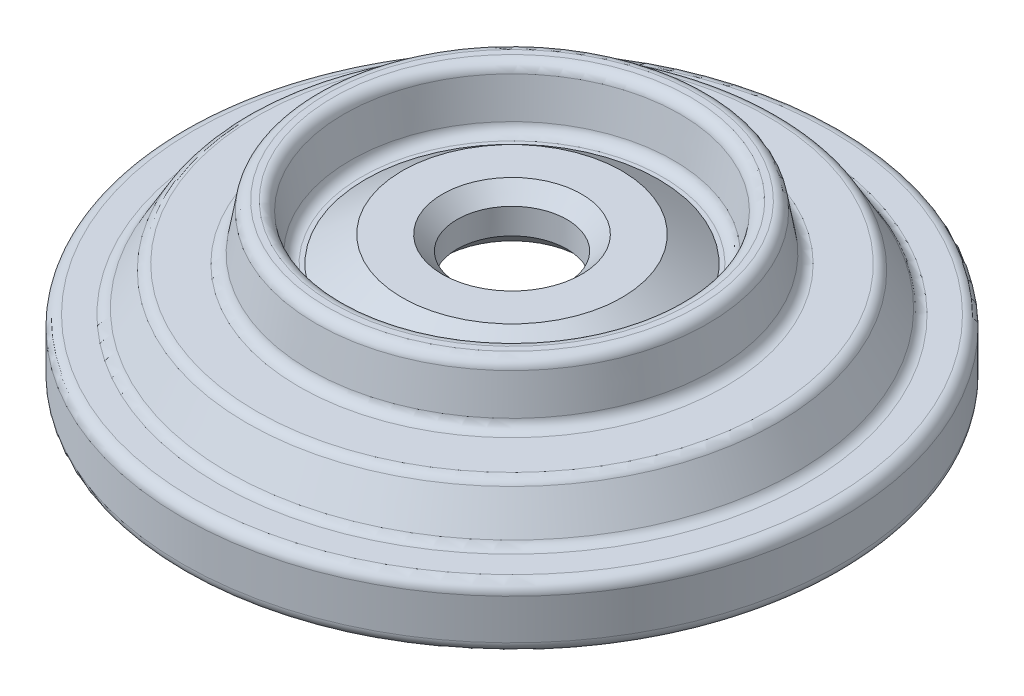
ISO-10303-21;
HEADER;
FILE_DESCRIPTION(('STEP AP214'),'2;1');
FILE_NAME('part.step','',(''),(''),'','','');
FILE_SCHEMA(('AUTOMOTIVE_DESIGN { 1 0 10303 214 1 1 1 1 }'));
ENDSEC;
DATA;
#1=APPLICATION_CONTEXT('core data for automotive mechanical design processes');
#2=APPLICATION_PROTOCOL_DEFINITION('international standard','automotive_design',2000,#1);
#3=PRODUCT_CONTEXT('',#1,'mechanical');
#4=PRODUCT('Part','Part','',(#3));
#5=PRODUCT_RELATED_PRODUCT_CATEGORY('part','',(#4));
#6=PRODUCT_DEFINITION_FORMATION('','',#4);
#7=PRODUCT_DEFINITION_CONTEXT('part definition',#1,'design');
#8=PRODUCT_DEFINITION('design','',#6,#7);
#9=PRODUCT_DEFINITION_SHAPE('','',#8);
#10=(LENGTH_UNIT() NAMED_UNIT(*) SI_UNIT(.MILLI.,.METRE.));
#11=(NAMED_UNIT(*) PLANE_ANGLE_UNIT() SI_UNIT($,.RADIAN.));
#12=(NAMED_UNIT(*) SI_UNIT($,.STERADIAN.) SOLID_ANGLE_UNIT());
#13=UNCERTAINTY_MEASURE_WITH_UNIT(LENGTH_MEASURE(1.E-05),#10,'distance_accuracy_value','');
#14=(GEOMETRIC_REPRESENTATION_CONTEXT(3) GLOBAL_UNCERTAINTY_ASSIGNED_CONTEXT((#13)) GLOBAL_UNIT_ASSIGNED_CONTEXT((#10,
#11,#12)) REPRESENTATION_CONTEXT('',''));
#15=CARTESIAN_POINT('',(0.,0.,0.));
#16=DIRECTION('',(0.,0.,1.));
#17=DIRECTION('',(1.,0.,0.));
#18=AXIS2_PLACEMENT_3D('',#15,#16,#17);
#19=CARTESIAN_POINT('',(-30.,15.,0.));
#20=DIRECTION('',(0.,1.,0.));
#21=DIRECTION('',(0.,0.,1.));
#22=AXIS2_PLACEMENT_3D('',#19,#20,#21);
#23=PLANE('',#22);
#24=CARTESIAN_POINT('',(0.,15.,0.));
#25=DIRECTION('',(0.,1.,0.));
#26=DIRECTION('',(0.,0.,1.));
#27=AXIS2_PLACEMENT_3D('',#24,#25,#26);
#28=CIRCLE('',#27,19.);
#29=CARTESIAN_POINT('',(0.,15.,19.));
#30=VERTEX_POINT('',#29);
#31=EDGE_CURVE('E10',#30,#30,#28,.F.);
#32=ORIENTED_EDGE('',*,*,#31,.T.);
#33=EDGE_LOOP('',(#32));
#34=FACE_BOUND('',#33,.T.);
#35=CARTESIAN_POINT('',(0.,15.,0.));
#36=DIRECTION('',(0.,1.,0.));
#37=DIRECTION('',(0.,0.,1.));
#38=AXIS2_PLACEMENT_3D('',#35,#36,#37);
#39=CIRCLE('',#38,30.);
#40=CARTESIAN_POINT('',(0.,15.,30.));
#41=VERTEX_POINT('',#40);
#42=EDGE_CURVE('E142',#41,#41,#39,.T.);
#43=ORIENTED_EDGE('',*,*,#42,.T.);
#44=EDGE_LOOP('',(#43));
#45=FACE_BOUND('',#44,.T.);
#46=ADVANCED_FACE('F41',(#34,#45),#23,.T.);
#47=CARTESIAN_POINT('',(0.,85.703125,0.));
#48=DIRECTION('',(0.,1.,0.));
#49=DIRECTION('',(0.,0.,1.));
#50=AXIS2_PLACEMENT_3D('',#47,#48,#49);
#51=CYLINDRICAL_SURFACE('',#50,15.);
#52=CARTESIAN_POINT('',(0.,4.00000000000002,0.));
#53=DIRECTION('',(0.,-1.,0.));
#54=DIRECTION('',(0.,0.,-1.));
#55=AXIS2_PLACEMENT_3D('',#52,#53,#54);
#56=CIRCLE('',#55,15.);
#57=CARTESIAN_POINT('',(0.,4.00000000000002,-15.));
#58=VERTEX_POINT('',#57);
#59=EDGE_CURVE('E50',#58,#58,#56,.T.);
#60=ORIENTED_EDGE('',*,*,#59,.T.);
#61=EDGE_LOOP('',(#60));
#62=FACE_BOUND('',#61,.T.);
#63=CARTESIAN_POINT('',(0.,11.,0.));
#64=DIRECTION('',(0.,1.,0.));
#65=DIRECTION('',(0.,0.,1.));
#66=AXIS2_PLACEMENT_3D('',#63,#64,#65);
#67=CIRCLE('',#66,15.);
#68=CARTESIAN_POINT('',(0.,11.,15.));
#69=VERTEX_POINT('',#68);
#70=EDGE_CURVE('E55',#69,#69,#67,.T.);
#71=ORIENTED_EDGE('',*,*,#70,.T.);
#72=EDGE_LOOP('',(#71));
#73=FACE_BOUND('',#72,.T.);
#74=ADVANCED_FACE('F163',(#62,#73),#51,.F.);
#75=CARTESIAN_POINT('',(-15.,0.,0.));
#76=DIRECTION('',(0.,-1.,0.));
#77=DIRECTION('',(0.,0.,-1.));
#78=AXIS2_PLACEMENT_3D('',#75,#76,#77);
#79=PLANE('',#78);
#80=CARTESIAN_POINT('',(0.,0.,0.));
#81=DIRECTION('',(0.,-1.,0.));
#82=DIRECTION('',(0.,0.,-1.));
#83=AXIS2_PLACEMENT_3D('',#80,#81,#82);
#84=CIRCLE('',#83,19.);
#85=CARTESIAN_POINT('',(0.,0.,-19.));
#86=VERTEX_POINT('',#85);
#87=EDGE_CURVE('E60',#86,#86,#84,.F.);
#88=ORIENTED_EDGE('',*,*,#87,.T.);
#89=EDGE_LOOP('',(#88));
#90=FACE_BOUND('',#89,.T.);
#91=CARTESIAN_POINT('',(0.,0.,0.));
#92=DIRECTION('',(0.,1.,0.));
#93=DIRECTION('',(0.,0.,1.));
#94=AXIS2_PLACEMENT_3D('',#91,#92,#93);
#95=CIRCLE('',#94,66.881197846483);
#96=CARTESIAN_POINT('',(0.,0.,66.881197846483));
#97=VERTEX_POINT('',#96);
#98=EDGE_CURVE('E66',#97,#97,#95,.T.);
#99=ORIENTED_EDGE('',*,*,#98,.F.);
#100=EDGE_LOOP('',(#99));
#101=FACE_BOUND('',#100,.T.);
#102=ADVANCED_FACE('F168',(#90,#101),#79,.T.);
#103=CARTESIAN_POINT('',(0.,-21.,0.));
#104=DIRECTION('',(0.,-1.,0.));
#105=DIRECTION('',(0.,0.,-1.));
#106=AXIS2_PLACEMENT_3D('',#103,#104,#105);
#107=CONICAL_SURFACE('',#106,79.005553499465,0.523598775598296);
#108=ORIENTED_EDGE('',*,*,#98,.T.);
#109=EDGE_LOOP('',(#108));
#110=FACE_BOUND('',#109,.T.);
#111=CARTESIAN_POINT('',(0.,-21.,0.));
#112=DIRECTION('',(0.,1.,0.));
#113=DIRECTION('',(0.,0.,1.));
#114=AXIS2_PLACEMENT_3D('',#111,#112,#113);
#115=CIRCLE('',#114,79.005553499465);
#116=CARTESIAN_POINT('',(0.,-21.,79.005553499465));
#117=VERTEX_POINT('',#116);
#118=EDGE_CURVE('E70',#117,#117,#115,.T.);
#119=ORIENTED_EDGE('',*,*,#118,.F.);
#120=EDGE_LOOP('',(#119));
#121=FACE_BOUND('',#120,.T.);
#122=ADVANCED_FACE('F178',(#110,#121),#107,.F.);
#123=CARTESIAN_POINT('',(-79.005553499465,-21.,0.));
#124=DIRECTION('',(0.,-1.,0.));
#125=DIRECTION('',(0.,0.,-1.));
#126=AXIS2_PLACEMENT_3D('',#123,#124,#125);
#127=PLANE('',#126);
#128=ORIENTED_EDGE('',*,*,#118,.T.);
#129=EDGE_LOOP('',(#128));
#130=FACE_BOUND('',#129,.T.);
#131=CARTESIAN_POINT('',(0.,-21.,0.));
#132=DIRECTION('',(0.,1.,0.));
#133=DIRECTION('',(0.,0.,1.));
#134=AXIS2_PLACEMENT_3D('',#131,#132,#133);
#135=CIRCLE('',#134,87.);
#136=CARTESIAN_POINT('',(0.,-21.,87.));
#137=VERTEX_POINT('',#136);
#138=EDGE_CURVE('E74',#137,#137,#135,.T.);
#139=ORIENTED_EDGE('',*,*,#138,.F.);
#140=EDGE_LOOP('',(#139));
#141=FACE_BOUND('',#140,.T.);
#142=ADVANCED_FACE('F182',(#130,#141),#127,.T.);
#143=CARTESIAN_POINT('',(0.,-18.,0.));
#144=DIRECTION('',(0.,1.,0.));
#145=DIRECTION('',(0.,0.,1.));
#146=AXIS2_PLACEMENT_3D('',#143,#144,#145);
#147=TOROIDAL_SURFACE('',#146,87.,3.);
#148=ORIENTED_EDGE('',*,*,#138,.T.);
#149=EDGE_LOOP('',(#148));
#150=FACE_BOUND('',#149,.T.);
#151=CARTESIAN_POINT('',(0.,-18.,0.));
#152=DIRECTION('',(0.,1.,0.));
#153=DIRECTION('',(0.,0.,1.));
#154=AXIS2_PLACEMENT_3D('',#151,#152,#153);
#155=CIRCLE('',#154,90.);
#156=CARTESIAN_POINT('',(0.,-18.,90.));
#157=VERTEX_POINT('',#156);
#158=EDGE_CURVE('E78',#157,#157,#155,.T.);
#159=ORIENTED_EDGE('',*,*,#158,.F.);
#160=EDGE_LOOP('',(#159));
#161=FACE_BOUND('',#160,.T.);
#162=ADVANCED_FACE('F186',(#150,#161),#147,.T.);
#163=CARTESIAN_POINT('',(0.,85.703125,0.));
#164=DIRECTION('',(0.,1.,0.));
#165=DIRECTION('',(0.,0.,1.));
#166=AXIS2_PLACEMENT_3D('',#163,#164,#165);
#167=CYLINDRICAL_SURFACE('',#166,90.);
#168=ORIENTED_EDGE('',*,*,#158,.T.);
#169=EDGE_LOOP('',(#168));
#170=FACE_BOUND('',#169,.T.);
#171=CARTESIAN_POINT('',(0.,-7.00000000000002,0.));
#172=DIRECTION('',(0.,1.,0.));
#173=DIRECTION('',(0.,0.,1.));
#174=AXIS2_PLACEMENT_3D('',#171,#172,#173);
#175=CIRCLE('',#174,90.);
#176=CARTESIAN_POINT('',(0.,-7.00000000000002,90.));
#177=VERTEX_POINT('',#176);
#178=EDGE_CURVE('E82',#177,#177,#175,.T.);
#179=ORIENTED_EDGE('',*,*,#178,.F.);
#180=EDGE_LOOP('',(#179));
#181=FACE_BOUND('',#180,.T.);
#182=ADVANCED_FACE('F190',(#170,#181),#167,.T.);
#183=CARTESIAN_POINT('',(0.,-7.,0.));
#184=DIRECTION('',(0.,1.,0.));
#185=DIRECTION('',(0.,0.,1.));
#186=AXIS2_PLACEMENT_3D('',#183,#184,#185);
#187=TOROIDAL_SURFACE('',#186,87.,3.);
#188=ORIENTED_EDGE('',*,*,#178,.T.);
#189=EDGE_LOOP('',(#188));
#190=FACE_BOUND('',#189,.T.);
#191=CARTESIAN_POINT('',(0.,-4.,0.));
#192=DIRECTION('',(0.,1.,0.));
#193=DIRECTION('',(0.,0.,1.));
#194=AXIS2_PLACEMENT_3D('',#191,#192,#193);
#195=CIRCLE('',#194,87.);
#196=CARTESIAN_POINT('',(0.,-4.,87.));
#197=VERTEX_POINT('',#196);
#198=EDGE_CURVE('E86',#197,#197,#195,.T.);
#199=ORIENTED_EDGE('',*,*,#198,.F.);
#200=EDGE_LOOP('',(#199));
#201=FACE_BOUND('',#200,.T.);
#202=ADVANCED_FACE('F194',(#190,#201),#187,.T.);
#203=CARTESIAN_POINT('',(-87.,-4.,0.));
#204=DIRECTION('',(0.,1.,0.));
#205=DIRECTION('',(0.,0.,1.));
#206=AXIS2_PLACEMENT_3D('',#203,#204,#205);
#207=PLANE('',#206);
#208=ORIENTED_EDGE('',*,*,#198,.T.);
#209=EDGE_LOOP('',(#208));
#210=FACE_BOUND('',#209,.T.);
#211=CARTESIAN_POINT('',(0.,-4.,0.));
#212=DIRECTION('',(0.,1.,0.));
#213=DIRECTION('',(0.,0.,1.));
#214=AXIS2_PLACEMENT_3D('',#211,#212,#213);
#215=CIRCLE('',#214,80.1602540378443);
#216=CARTESIAN_POINT('',(0.,-4.,80.1602540378443));
#217=VERTEX_POINT('',#216);
#218=EDGE_CURVE('E90',#217,#217,#215,.T.);
#219=ORIENTED_EDGE('',*,*,#218,.F.);
#220=EDGE_LOOP('',(#219));
#221=FACE_BOUND('',#220,.T.);
#222=ADVANCED_FACE('F198',(#210,#221),#207,.T.);
#223=CARTESIAN_POINT('',(0.,-1.,0.));
#224=DIRECTION('',(0.,1.,0.));
#225=DIRECTION('',(0.,0.,1.));
#226=AXIS2_PLACEMENT_3D('',#223,#224,#225);
#227=TOROIDAL_SURFACE('',#226,80.1602540378443,3.00000000000001);
#228=ORIENTED_EDGE('',*,*,#218,.T.);
#229=EDGE_LOOP('',(#228));
#230=FACE_BOUND('',#229,.T.);
#231=CARTESIAN_POINT('',(0.,-2.5,0.));
#232=DIRECTION('',(0.,1.,0.));
#233=DIRECTION('',(0.,0.,1.));
#234=AXIS2_PLACEMENT_3D('',#231,#232,#233);
#235=CIRCLE('',#234,77.562177826491);
#236=CARTESIAN_POINT('',(0.,-2.5,77.562177826491));
#237=VERTEX_POINT('',#236);
#238=EDGE_CURVE('E94',#237,#237,#235,.T.);
#239=ORIENTED_EDGE('',*,*,#238,.F.);
#240=EDGE_LOOP('',(#239));
#241=FACE_BOUND('',#240,.T.);
#242=ADVANCED_FACE('F202',(#230,#241),#227,.F.);
#243=CARTESIAN_POINT('',(0.,6.49999999999998,0.));
#244=DIRECTION('',(0.,-1.,0.));
#245=DIRECTION('',(0.,0.,-1.));
#246=AXIS2_PLACEMENT_3D('',#243,#244,#245);
#247=CONICAL_SURFACE('',#246,72.3660254037844,0.523598775598296);
#248=ORIENTED_EDGE('',*,*,#238,.T.);
#249=EDGE_LOOP('',(#248));
#250=FACE_BOUND('',#249,.T.);
#251=CARTESIAN_POINT('',(0.,6.49999999999998,0.));
#252=DIRECTION('',(0.,1.,0.));
#253=DIRECTION('',(0.,0.,1.));
#254=AXIS2_PLACEMENT_3D('',#251,#252,#253);
#255=CIRCLE('',#254,72.3660254037844);
#256=CARTESIAN_POINT('',(0.,6.49999999999998,72.3660254037844));
#257=VERTEX_POINT('',#256);
#258=EDGE_CURVE('E98',#257,#257,#255,.T.);
#259=ORIENTED_EDGE('',*,*,#258,.F.);
#260=EDGE_LOOP('',(#259));
#261=FACE_BOUND('',#260,.T.);
#262=ADVANCED_FACE('F206',(#250,#261),#247,.T.);
#263=CARTESIAN_POINT('',(0.,4.99999999999999,0.));
#264=DIRECTION('',(0.,1.,0.));
#265=DIRECTION('',(0.,0.,1.));
#266=AXIS2_PLACEMENT_3D('',#263,#264,#265);
#267=TOROIDAL_SURFACE('',#266,69.7679491924311,3.);
#268=ORIENTED_EDGE('',*,*,#258,.T.);
#269=EDGE_LOOP('',(#268));
#270=FACE_BOUND('',#269,.T.);
#271=CARTESIAN_POINT('',(0.,7.99999999999999,0.));
#272=DIRECTION('',(0.,1.,0.));
#273=DIRECTION('',(0.,0.,1.));
#274=AXIS2_PLACEMENT_3D('',#271,#272,#273);
#275=CIRCLE('',#274,69.7679491924311);
#276=CARTESIAN_POINT('',(0.,7.99999999999999,69.7679491924311));
#277=VERTEX_POINT('',#276);
#278=EDGE_CURVE('E102',#277,#277,#275,.T.);
#279=ORIENTED_EDGE('',*,*,#278,.F.);
#280=EDGE_LOOP('',(#279));
#281=FACE_BOUND('',#280,.T.);
#282=ADVANCED_FACE('F210',(#270,#281),#267,.T.);
#283=CARTESIAN_POINT('',(-69.7679491924311,7.99999999999999,0.));
#284=DIRECTION('',(0.,1.,0.));
#285=DIRECTION('',(0.,0.,1.));
#286=AXIS2_PLACEMENT_3D('',#283,#284,#285);
#287=PLANE('',#286);
#288=ORIENTED_EDGE('',*,*,#278,.T.);
#289=EDGE_LOOP('',(#288));
#290=FACE_BOUND('',#289,.T.);
#291=CARTESIAN_POINT('',(0.,7.99999999999999,0.));
#292=DIRECTION('',(0.,1.,0.));
#293=DIRECTION('',(0.,0.,1.));
#294=AXIS2_PLACEMENT_3D('',#291,#292,#293);
#295=CIRCLE('',#294,58.1622036041588);
#296=CARTESIAN_POINT('',(0.,7.99999999999999,58.1622036041588));
#297=VERTEX_POINT('',#296);
#298=EDGE_CURVE('E106',#297,#297,#295,.T.);
#299=ORIENTED_EDGE('',*,*,#298,.F.);
#300=EDGE_LOOP('',(#299));
#301=FACE_BOUND('',#300,.T.);
#302=ADVANCED_FACE('F214',(#290,#301),#287,.T.);
#303=CARTESIAN_POINT('',(0.,11.,0.));
#304=DIRECTION('',(0.,1.,0.));
#305=DIRECTION('',(0.,0.,1.));
#306=AXIS2_PLACEMENT_3D('',#303,#304,#305);
#307=TOROIDAL_SURFACE('',#306,58.1622036041588,3.);
#308=ORIENTED_EDGE('',*,*,#298,.T.);
#309=EDGE_LOOP('',(#308));
#310=FACE_BOUND('',#309,.T.);
#311=CARTESIAN_POINT('',(0.,10.4790554669992,0.));
#312=DIRECTION('',(0.,1.,0.));
#313=DIRECTION('',(0.,0.,1.));
#314=AXIS2_PLACEMENT_3D('',#311,#312,#313);
#315=CIRCLE('',#314,55.2077803451221);
#316=CARTESIAN_POINT('',(0.,10.4790554669992,55.2077803451221));
#317=VERTEX_POINT('',#316);
#318=EDGE_CURVE('E110',#317,#317,#315,.T.);
#319=ORIENTED_EDGE('',*,*,#318,.F.);
#320=EDGE_LOOP('',(#319));
#321=FACE_BOUND('',#320,.T.);
#322=ADVANCED_FACE('F218',(#310,#321),#307,.F.);
#323=CARTESIAN_POINT('',(0.,20.5209445330008,0.));
#324=DIRECTION('',(0.,-1.,0.));
#325=DIRECTION('',(0.,0.,-1.));
#326=AXIS2_PLACEMENT_3D('',#323,#324,#325);
#327=CONICAL_SURFACE('',#326,53.4371243655048,0.17453292519943);
#328=ORIENTED_EDGE('',*,*,#318,.T.);
#329=EDGE_LOOP('',(#328));
#330=FACE_BOUND('',#329,.T.);
#331=CARTESIAN_POINT('',(0.,20.5209445330008,0.));
#332=DIRECTION('',(0.,1.,0.));
#333=DIRECTION('',(0.,0.,1.));
#334=AXIS2_PLACEMENT_3D('',#331,#332,#333);
#335=CIRCLE('',#334,53.4371243655048);
#336=CARTESIAN_POINT('',(0.,20.5209445330008,53.4371243655048));
#337=VERTEX_POINT('',#336);
#338=EDGE_CURVE('E114',#337,#337,#335,.T.);
#339=ORIENTED_EDGE('',*,*,#338,.F.);
#340=EDGE_LOOP('',(#339));
#341=FACE_BOUND('',#340,.T.);
#342=ADVANCED_FACE('F222',(#330,#341),#327,.T.);
#343=CARTESIAN_POINT('',(0.,20.,0.));
#344=DIRECTION('',(0.,1.,0.));
#345=DIRECTION('',(0.,0.,1.));
#346=AXIS2_PLACEMENT_3D('',#343,#344,#345);
#347=TOROIDAL_SURFACE('',#346,50.4827011064681,3.);
#348=ORIENTED_EDGE('',*,*,#338,.T.);
#349=EDGE_LOOP('',(#348));
#350=FACE_BOUND('',#349,.T.);
#351=CARTESIAN_POINT('',(0.,23.,0.));
#352=DIRECTION('',(0.,1.,0.));
#353=DIRECTION('',(0.,0.,1.));
#354=AXIS2_PLACEMENT_3D('',#351,#352,#353);
#355=CIRCLE('',#354,50.4827011064681);
#356=CARTESIAN_POINT('',(0.,23.,50.4827011064681));
#357=VERTEX_POINT('',#356);
#358=EDGE_CURVE('E118',#357,#357,#355,.T.);
#359=ORIENTED_EDGE('',*,*,#358,.F.);
#360=EDGE_LOOP('',(#359));
#361=FACE_BOUND('',#360,.T.);
#362=ADVANCED_FACE('F226',(#350,#361),#347,.T.);
#363=CARTESIAN_POINT('',(-50.4827011064681,23.,0.));
#364=DIRECTION('',(0.,1.,0.));
#365=DIRECTION('',(0.,0.,1.));
#366=AXIS2_PLACEMENT_3D('',#363,#364,#365);
#367=PLANE('',#366);
#368=ORIENTED_EDGE('',*,*,#358,.T.);
#369=EDGE_LOOP('',(#368));
#370=FACE_BOUND('',#369,.T.);
#371=CARTESIAN_POINT('',(0.,23.,0.));
#372=DIRECTION('',(0.,1.,0.));
#373=DIRECTION('',(0.,0.,1.));
#374=AXIS2_PLACEMENT_3D('',#371,#372,#373);
#375=CIRCLE('',#374,48.8071083147857);
#376=CARTESIAN_POINT('',(0.,23.,48.8071083147857));
#377=VERTEX_POINT('',#376);
#378=EDGE_CURVE('E122',#377,#377,#375,.T.);
#379=ORIENTED_EDGE('',*,*,#378,.F.);
#380=EDGE_LOOP('',(#379));
#381=FACE_BOUND('',#380,.T.);
#382=ADVANCED_FACE('F230',(#370,#381),#367,.T.);
#383=CARTESIAN_POINT('',(0.,20.,0.));
#384=DIRECTION('',(0.,1.,0.));
#385=DIRECTION('',(0.,0.,1.));
#386=AXIS2_PLACEMENT_3D('',#383,#384,#385);
#387=TOROIDAL_SURFACE('',#386,48.8071083147857,3.);
#388=ORIENTED_EDGE('',*,*,#378,.T.);
#389=EDGE_LOOP('',(#388));
#390=FACE_BOUND('',#389,.T.);
#391=CARTESIAN_POINT('',(0.,20.5209445330008,0.));
#392=DIRECTION('',(0.,1.,0.));
#393=DIRECTION('',(0.,0.,1.));
#394=AXIS2_PLACEMENT_3D('',#391,#392,#393);
#395=CIRCLE('',#394,45.8526850557491);
#396=CARTESIAN_POINT('',(0.,20.5209445330008,45.8526850557491));
#397=VERTEX_POINT('',#396);
#398=EDGE_CURVE('E126',#397,#397,#395,.T.);
#399=ORIENTED_EDGE('',*,*,#398,.F.);
#400=EDGE_LOOP('',(#399));
#401=FACE_BOUND('',#400,.T.);
#402=ADVANCED_FACE('F234',(#390,#401),#387,.T.);
#403=CARTESIAN_POINT('',(0.,10.4790554669992,0.));
#404=DIRECTION('',(0.,1.,0.));
#405=DIRECTION('',(0.,0.,1.));
#406=AXIS2_PLACEMENT_3D('',#403,#404,#405);
#407=CONICAL_SURFACE('',#406,44.0820290761317,0.17453292519943);
#408=ORIENTED_EDGE('',*,*,#398,.T.);
#409=EDGE_LOOP('',(#408));
#410=FACE_BOUND('',#409,.T.);
#411=CARTESIAN_POINT('',(0.,10.4790554669992,0.));
#412=DIRECTION('',(0.,1.,0.));
#413=DIRECTION('',(0.,0.,1.));
#414=AXIS2_PLACEMENT_3D('',#411,#412,#413);
#415=CIRCLE('',#414,44.0820290761317);
#416=CARTESIAN_POINT('',(0.,10.4790554669992,44.0820290761317));
#417=VERTEX_POINT('',#416);
#418=EDGE_CURVE('E130',#417,#417,#415,.T.);
#419=ORIENTED_EDGE('',*,*,#418,.F.);
#420=EDGE_LOOP('',(#419));
#421=FACE_BOUND('',#420,.T.);
#422=ADVANCED_FACE('F238',(#410,#421),#407,.F.);
#423=CARTESIAN_POINT('',(0.,11.,0.));
#424=DIRECTION('',(0.,1.,0.));
#425=DIRECTION('',(0.,0.,1.));
#426=AXIS2_PLACEMENT_3D('',#423,#424,#425);
#427=TOROIDAL_SURFACE('',#426,41.1276058170951,3.);
#428=ORIENTED_EDGE('',*,*,#418,.T.);
#429=EDGE_LOOP('',(#428));
#430=FACE_BOUND('',#429,.T.);
#431=CARTESIAN_POINT('',(0.,7.99999999999999,0.));
#432=DIRECTION('',(0.,1.,0.));
#433=DIRECTION('',(0.,0.,1.));
#434=AXIS2_PLACEMENT_3D('',#431,#432,#433);
#435=CIRCLE('',#434,41.1276058170951);
#436=CARTESIAN_POINT('',(0.,7.99999999999999,41.1276058170951));
#437=VERTEX_POINT('',#436);
#438=EDGE_CURVE('E134',#437,#437,#435,.T.);
#439=ORIENTED_EDGE('',*,*,#438,.F.);
#440=EDGE_LOOP('',(#439));
#441=FACE_BOUND('',#440,.T.);
#442=ADVANCED_FACE('F159',(#430,#441),#427,.F.);
#443=CARTESIAN_POINT('',(-41.1276058170951,8.,0.));
#444=DIRECTION('',(0.,1.,0.));
#445=DIRECTION('',(0.,0.,1.));
#446=AXIS2_PLACEMENT_3D('',#443,#444,#445);
#447=PLANE('',#446);
#448=ORIENTED_EDGE('',*,*,#438,.T.);
#449=EDGE_LOOP('',(#448));
#450=FACE_BOUND('',#449,.T.);
#451=CARTESIAN_POINT('',(0.,7.99999999999999,0.));
#452=DIRECTION('',(0.,1.,0.));
#453=DIRECTION('',(0.,0.,1.));
#454=AXIS2_PLACEMENT_3D('',#451,#452,#453);
#455=CIRCLE('',#454,39.9970360471948);
#456=CARTESIAN_POINT('',(0.,7.99999999999999,39.9970360471948));
#457=VERTEX_POINT('',#456);
#458=EDGE_CURVE('E138',#457,#457,#455,.T.);
#459=ORIENTED_EDGE('',*,*,#458,.F.);
#460=EDGE_LOOP('',(#459));
#461=FACE_BOUND('',#460,.T.);
#462=ADVANCED_FACE('F151',(#450,#461),#447,.T.);
#463=CARTESIAN_POINT('',(0.,15.,0.));
#464=DIRECTION('',(0.,-1.,0.));
#465=DIRECTION('',(0.,0.,-1.));
#466=AXIS2_PLACEMENT_3D('',#463,#464,#465);
#467=CONICAL_SURFACE('',#466,30.,0.95993108859688);
#468=ORIENTED_EDGE('',*,*,#458,.T.);
#469=EDGE_LOOP('',(#468));
#470=FACE_BOUND('',#469,.T.);
#471=ORIENTED_EDGE('',*,*,#42,.F.);
#472=EDGE_LOOP('',(#471));
#473=FACE_BOUND('',#472,.T.);
#474=ADVANCED_FACE('F148',(#470,#473),#467,.T.);
#475=CARTESIAN_POINT('',(0.,0.,0.));
#476=DIRECTION('',(0.,-1.,0.));
#477=DIRECTION('',(0.,0.,-1.));
#478=AXIS2_PLACEMENT_3D('',#475,#476,#477);
#479=CONICAL_SURFACE('',#478,19.,0.785398163397449);
#480=ORIENTED_EDGE('',*,*,#59,.F.);
#481=EDGE_LOOP('',(#480));
#482=FACE_BOUND('',#481,.T.);
#483=ORIENTED_EDGE('',*,*,#87,.F.);
#484=EDGE_LOOP('',(#483));
#485=FACE_BOUND('',#484,.T.);
#486=ADVANCED_FACE('F150',(#482,#485),#479,.F.);
#487=CARTESIAN_POINT('',(0.,11.,0.));
#488=DIRECTION('',(0.,1.,0.));
#489=DIRECTION('',(0.,0.,1.));
#490=AXIS2_PLACEMENT_3D('',#487,#488,#489);
#491=CONICAL_SURFACE('',#490,15.,0.785398163397449);
#492=ORIENTED_EDGE('',*,*,#31,.F.);
#493=EDGE_LOOP('',(#492));
#494=FACE_BOUND('',#493,.T.);
#495=ORIENTED_EDGE('',*,*,#70,.F.);
#496=EDGE_LOOP('',(#495));
#497=FACE_BOUND('',#496,.T.);
#498=ADVANCED_FACE('F44',(#494,#497),#491,.F.);
#499=CLOSED_SHELL('',(#46,#74,#102,#122,#142,#162,#182,#202,#222,#242,#262,#282,#302,#322,#342,
#362,#382,#402,#422,#442,#462,#474,#486,#498));
#500=MANIFOLD_SOLID_BREP('B2',#499);
#501=ADVANCED_BREP_SHAPE_REPRESENTATION('',(#18,#500),#14);
#502=SHAPE_DEFINITION_REPRESENTATION(#9,#501);
ENDSEC;
END-ISO-10303-21;
